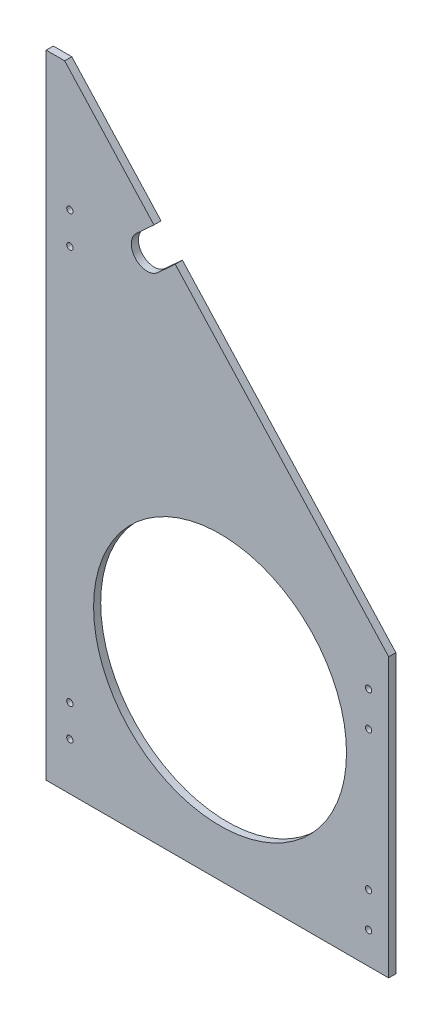
ISO-10303-21;
HEADER;
FILE_DESCRIPTION(('STEP AP214'),'2;1');
FILE_NAME('part.step','',(''),(''),'','','');
FILE_SCHEMA(('AUTOMOTIVE_DESIGN { 1 0 10303 214 1 1 1 1 }'));
ENDSEC;
DATA;
#1=APPLICATION_CONTEXT('core data for automotive mechanical design processes');
#2=APPLICATION_PROTOCOL_DEFINITION('international standard','automotive_design',2000,#1);
#3=PRODUCT_CONTEXT('',#1,'mechanical');
#4=PRODUCT('Part','Part','',(#3));
#5=PRODUCT_RELATED_PRODUCT_CATEGORY('part','',(#4));
#6=PRODUCT_DEFINITION_FORMATION('','',#4);
#7=PRODUCT_DEFINITION_CONTEXT('part definition',#1,'design');
#8=PRODUCT_DEFINITION('design','',#6,#7);
#9=PRODUCT_DEFINITION_SHAPE('','',#8);
#10=(LENGTH_UNIT() NAMED_UNIT(*) SI_UNIT(.MILLI.,.METRE.));
#11=(NAMED_UNIT(*) PLANE_ANGLE_UNIT() SI_UNIT($,.RADIAN.));
#12=(NAMED_UNIT(*) SI_UNIT($,.STERADIAN.) SOLID_ANGLE_UNIT());
#13=UNCERTAINTY_MEASURE_WITH_UNIT(LENGTH_MEASURE(1.E-05),#10,'distance_accuracy_value','');
#14=(GEOMETRIC_REPRESENTATION_CONTEXT(3) GLOBAL_UNCERTAINTY_ASSIGNED_CONTEXT((#13)) GLOBAL_UNIT_ASSIGNED_CONTEXT((#10,
#11,#12)) REPRESENTATION_CONTEXT('',''));
#15=CARTESIAN_POINT('',(0.,0.,0.));
#16=DIRECTION('',(0.,0.,1.));
#17=DIRECTION('',(1.,0.,0.));
#18=AXIS2_PLACEMENT_3D('',#15,#16,#17);
#19=CARTESIAN_POINT('',(216.7,176.,4.5));
#20=DIRECTION('',(-0.737700712036125,-0.675127883783061,0.));
#21=DIRECTION('',(0.675127883783061,-0.737700712036125,0.));
#22=AXIS2_PLACEMENT_3D('',#19,#20,#21);
#23=PLANE('',#22);
#24=DIRECTION('',(-0.675127883783061,0.737700712036125,0.));
#25=VECTOR('',#24,1.);
#26=CARTESIAN_POINT('',(216.7,176.,4.5));
#27=LINE('',#26,#25);
#28=CARTESIAN_POINT('',(68.1718655677265,338.294156647948,4.5));
#29=VERTEX_POINT('',#28);
#30=CARTESIAN_POINT('',(11.7,400.,4.5));
#31=VERTEX_POINT('',#30);
#32=EDGE_CURVE('E106',#29,#31,#27,.T.);
#33=ORIENTED_EDGE('',*,*,#32,.F.);
#34=DIRECTION('',(0.,0.,1.));
#35=VECTOR('',#34,1.);
#36=CARTESIAN_POINT('',(68.1718655677265,338.294156647948,-0.00100000000000013));
#37=LINE('',#36,#35);
#38=CARTESIAN_POINT('',(68.1718655677265,338.294156647948,0.));
#39=VERTEX_POINT('',#38);
#40=EDGE_CURVE('E189',#39,#29,#37,.T.);
#41=ORIENTED_EDGE('',*,*,#40,.F.);
#42=DIRECTION('',(-0.675127883783061,0.737700712036125,0.));
#43=VECTOR('',#42,1.);
#44=CARTESIAN_POINT('',(216.7,176.,0.));
#45=LINE('',#44,#43);
#46=CARTESIAN_POINT('',(11.7,400.,0.));
#47=VERTEX_POINT('',#46);
#48=EDGE_CURVE('E132',#39,#47,#45,.T.);
#49=ORIENTED_EDGE('',*,*,#48,.T.);
#50=DIRECTION('',(0.,0.,-1.));
#51=VECTOR('',#50,1.);
#52=CARTESIAN_POINT('',(11.7,400.,4.5));
#53=LINE('',#52,#51);
#54=EDGE_CURVE('E116',#31,#47,#53,.T.);
#55=ORIENTED_EDGE('',*,*,#54,.F.);
#56=EDGE_LOOP('',(#33,#41,#49,#55));
#57=FACE_BOUND('',#56,.T.);
#58=ADVANCED_FACE('F34',(#57),#23,.F.);
#59=CARTESIAN_POINT('',(0.,0.,4.5));
#60=DIRECTION('',(0.,0.,1.));
#61=DIRECTION('',(1.,0.,0.));
#62=AXIS2_PLACEMENT_3D('',#59,#60,#61);
#63=PLANE('',#62);
#64=CARTESIAN_POINT('',(203.95,20.,4.5));
#65=DIRECTION('',(0.,0.,1.));
#66=DIRECTION('',(1.,0.,0.));
#67=AXIS2_PLACEMENT_3D('',#64,#65,#66);
#68=CIRCLE('',#67,2.);
#69=CARTESIAN_POINT('',(205.95,20.,4.5));
#70=VERTEX_POINT('',#69);
#71=EDGE_CURVE('E213',#70,#70,#68,.T.);
#72=ORIENTED_EDGE('',*,*,#71,.F.);
#73=EDGE_LOOP('',(#72));
#74=FACE_BOUND('',#73,.T.);
#75=DIRECTION('',(-0.737700712036125,-0.675127883783061,0.));
#76=VECTOR('',#75,1.);
#77=CARTESIAN_POINT('',(57.1063548871846,328.167238391202,4.5));
#78=LINE('',#77,#76);
#79=CARTESIAN_POINT('',(57.1063548871846,328.167238391202,4.5));
#80=VERTEX_POINT('',#79);
#81=EDGE_CURVE('E171',#29,#80,#78,.T.);
#82=ORIENTED_EDGE('',*,*,#81,.F.);
#83=ORIENTED_EDGE('',*,*,#32,.T.);
#84=DIRECTION('',(-1.,0.,0.));
#85=VECTOR('',#84,1.);
#86=CARTESIAN_POINT('',(0.,400.,4.5));
#87=LINE('',#86,#85);
#88=CARTESIAN_POINT('',(0.,400.,4.5));
#89=VERTEX_POINT('',#88);
#90=EDGE_CURVE('E58',#31,#89,#87,.T.);
#91=ORIENTED_EDGE('',*,*,#90,.T.);
#92=DIRECTION('',(0.,-1.,0.));
#93=VECTOR('',#92,1.);
#94=CARTESIAN_POINT('',(0.,400.,4.5));
#95=LINE('',#94,#93);
#96=CARTESIAN_POINT('',(0.,0.,4.5));
#97=VERTEX_POINT('',#96);
#98=EDGE_CURVE('E136',#89,#97,#95,.T.);
#99=ORIENTED_EDGE('',*,*,#98,.T.);
#100=DIRECTION('',(1.,0.,0.));
#101=VECTOR('',#100,1.);
#102=CARTESIAN_POINT('',(0.,0.,4.5));
#103=LINE('',#102,#101);
#104=CARTESIAN_POINT('',(216.7,0.,4.5));
#105=VERTEX_POINT('',#104);
#106=EDGE_CURVE('E90',#97,#105,#103,.T.);
#107=ORIENTED_EDGE('',*,*,#106,.T.);
#108=DIRECTION('',(0.,1.,0.));
#109=VECTOR('',#108,1.);
#110=CARTESIAN_POINT('',(216.7,0.,4.5));
#111=LINE('',#110,#109);
#112=CARTESIAN_POINT('',(216.7,176.,4.5));
#113=VERTEX_POINT('',#112);
#114=EDGE_CURVE('E97',#105,#113,#111,.T.);
#115=ORIENTED_EDGE('',*,*,#114,.T.);
#116=CARTESIAN_POINT('',(81.6744232433878,323.540142407225,4.5));
#117=VERTEX_POINT('',#116);
#118=EDGE_CURVE('E103',#113,#117,#27,.T.);
#119=ORIENTED_EDGE('',*,*,#118,.T.);
#120=DIRECTION('',(0.737700712036125,0.675127883783061,0.));
#121=VECTOR('',#120,1.);
#122=CARTESIAN_POINT('',(70.6089125628459,313.413224150479,4.5));
#123=LINE('',#122,#121);
#124=CARTESIAN_POINT('',(70.6089125628459,313.413224150479,4.5));
#125=VERTEX_POINT('',#124);
#126=EDGE_CURVE('E49',#125,#117,#123,.T.);
#127=ORIENTED_EDGE('',*,*,#126,.F.);
#128=CARTESIAN_POINT('',(63.8576337250153,320.79023127084,4.5));
#129=DIRECTION('',(0.,0.,1.));
#130=DIRECTION('',(1.,0.,0.));
#131=AXIS2_PLACEMENT_3D('',#128,#129,#130);
#132=CIRCLE('',#131,10.);
#133=EDGE_CURVE('E170',#80,#125,#132,.T.);
#134=ORIENTED_EDGE('',*,*,#133,.F.);
#135=EDGE_LOOP('',(#82,#83,#91,#99,#107,#115,#119,#127,#134));
#136=FACE_BOUND('',#135,.T.);
#137=CARTESIAN_POINT('',(15.,320.,4.5));
#138=DIRECTION('',(0.,0.,1.));
#139=DIRECTION('',(1.,0.,0.));
#140=AXIS2_PLACEMENT_3D('',#137,#138,#139);
#141=CIRCLE('',#140,2.00000000000001);
#142=CARTESIAN_POINT('',(17.,320.,4.5));
#143=VERTEX_POINT('',#142);
#144=EDGE_CURVE('E174',#143,#143,#141,.T.);
#145=ORIENTED_EDGE('',*,*,#144,.F.);
#146=EDGE_LOOP('',(#145));
#147=FACE_BOUND('',#146,.T.);
#148=CARTESIAN_POINT('',(15.,300.,4.5));
#149=DIRECTION('',(0.,0.,1.));
#150=DIRECTION('',(1.,0.,0.));
#151=AXIS2_PLACEMENT_3D('',#148,#149,#150);
#152=CIRCLE('',#151,2.00000000000001);
#153=CARTESIAN_POINT('',(17.,300.,4.5));
#154=VERTEX_POINT('',#153);
#155=EDGE_CURVE('E314',#154,#154,#152,.T.);
#156=ORIENTED_EDGE('',*,*,#155,.F.);
#157=EDGE_LOOP('',(#156));
#158=FACE_BOUND('',#157,.T.);
#159=CARTESIAN_POINT('',(15.,50.,4.5));
#160=DIRECTION('',(0.,0.,1.));
#161=DIRECTION('',(1.,0.,0.));
#162=AXIS2_PLACEMENT_3D('',#159,#160,#161);
#163=CIRCLE('',#162,2.00000000000001);
#164=CARTESIAN_POINT('',(17.,50.,4.5));
#165=VERTEX_POINT('',#164);
#166=EDGE_CURVE('E308',#165,#165,#163,.T.);
#167=ORIENTED_EDGE('',*,*,#166,.F.);
#168=EDGE_LOOP('',(#167));
#169=FACE_BOUND('',#168,.T.);
#170=CARTESIAN_POINT('',(203.95,42.,4.5));
#171=DIRECTION('',(0.,0.,1.));
#172=DIRECTION('',(1.,0.,0.));
#173=AXIS2_PLACEMENT_3D('',#170,#171,#172);
#174=CIRCLE('',#173,2.);
#175=CARTESIAN_POINT('',(205.95,42.,4.5));
#176=VERTEX_POINT('',#175);
#177=EDGE_CURVE('E206',#176,#176,#174,.T.);
#178=ORIENTED_EDGE('',*,*,#177,.F.);
#179=EDGE_LOOP('',(#178));
#180=FACE_BOUND('',#179,.T.);
#181=CARTESIAN_POINT('',(203.95,130.,4.5));
#182=DIRECTION('',(0.,0.,1.));
#183=DIRECTION('',(1.,0.,0.));
#184=AXIS2_PLACEMENT_3D('',#181,#182,#183);
#185=CIRCLE('',#184,2.);
#186=CARTESIAN_POINT('',(205.95,130.,4.5));
#187=VERTEX_POINT('',#186);
#188=EDGE_CURVE('E199',#187,#187,#185,.T.);
#189=ORIENTED_EDGE('',*,*,#188,.F.);
#190=EDGE_LOOP('',(#189));
#191=FACE_BOUND('',#190,.T.);
#192=CARTESIAN_POINT('',(203.95,152.,4.5));
#193=DIRECTION('',(0.,0.,1.));
#194=DIRECTION('',(1.,0.,0.));
#195=AXIS2_PLACEMENT_3D('',#192,#193,#194);
#196=CIRCLE('',#195,2.);
#197=CARTESIAN_POINT('',(205.95,152.,4.5));
#198=VERTEX_POINT('',#197);
#199=EDGE_CURVE('E192',#198,#198,#196,.T.);
#200=ORIENTED_EDGE('',*,*,#199,.F.);
#201=EDGE_LOOP('',(#200));
#202=FACE_BOUND('',#201,.T.);
#203=CARTESIAN_POINT('',(15.,30.,4.5));
#204=DIRECTION('',(0.,0.,1.));
#205=DIRECTION('',(1.,0.,0.));
#206=AXIS2_PLACEMENT_3D('',#203,#204,#205);
#207=CIRCLE('',#206,2.00000000000001);
#208=CARTESIAN_POINT('',(17.,30.,4.5));
#209=VERTEX_POINT('',#208);
#210=EDGE_CURVE('E200',#209,#209,#207,.T.);
#211=ORIENTED_EDGE('',*,*,#210,.F.);
#212=EDGE_LOOP('',(#211));
#213=FACE_BOUND('',#212,.T.);
#214=CARTESIAN_POINT('',(110.,110.,4.5));
#215=DIRECTION('',(0.,0.,1.));
#216=DIRECTION('',(1.,0.,0.));
#217=AXIS2_PLACEMENT_3D('',#214,#215,#216);
#218=CIRCLE('',#217,80.);
#219=CARTESIAN_POINT('',(190.,110.,4.5));
#220=VERTEX_POINT('',#219);
#221=EDGE_CURVE('E129',#220,#220,#218,.T.);
#222=ORIENTED_EDGE('',*,*,#221,.F.);
#223=EDGE_LOOP('',(#222));
#224=FACE_BOUND('',#223,.T.);
#225=ADVANCED_FACE('F100',(#74,#136,#147,#158,#169,#180,#191,#202,#213,#224),#63,.T.);
#226=CARTESIAN_POINT('',(0.,0.,0.));
#227=DIRECTION('',(0.,0.,1.));
#228=DIRECTION('',(1.,0.,0.));
#229=AXIS2_PLACEMENT_3D('',#226,#227,#228);
#230=PLANE('',#229);
#231=CARTESIAN_POINT('',(203.95,20.,0.));
#232=DIRECTION('',(0.,0.,1.));
#233=DIRECTION('',(1.,0.,0.));
#234=AXIS2_PLACEMENT_3D('',#231,#232,#233);
#235=CIRCLE('',#234,2.);
#236=CARTESIAN_POINT('',(205.95,20.,0.));
#237=VERTEX_POINT('',#236);
#238=EDGE_CURVE('E223',#237,#237,#235,.F.);
#239=ORIENTED_EDGE('',*,*,#238,.F.);
#240=EDGE_LOOP('',(#239));
#241=FACE_BOUND('',#240,.T.);
#242=CARTESIAN_POINT('',(15.,320.,0.));
#243=DIRECTION('',(0.,0.,1.));
#244=DIRECTION('',(1.,0.,0.));
#245=AXIS2_PLACEMENT_3D('',#242,#243,#244);
#246=CIRCLE('',#245,2.00000000000001);
#247=CARTESIAN_POINT('',(17.,320.,0.));
#248=VERTEX_POINT('',#247);
#249=EDGE_CURVE('E181',#248,#248,#246,.F.);
#250=ORIENTED_EDGE('',*,*,#249,.F.);
#251=EDGE_LOOP('',(#250));
#252=FACE_BOUND('',#251,.T.);
#253=CARTESIAN_POINT('',(15.,300.,0.));
#254=DIRECTION('',(0.,0.,1.));
#255=DIRECTION('',(1.,0.,0.));
#256=AXIS2_PLACEMENT_3D('',#253,#254,#255);
#257=CIRCLE('',#256,2.00000000000001);
#258=CARTESIAN_POINT('',(17.,300.,0.));
#259=VERTEX_POINT('',#258);
#260=EDGE_CURVE('E311',#259,#259,#257,.F.);
#261=ORIENTED_EDGE('',*,*,#260,.F.);
#262=EDGE_LOOP('',(#261));
#263=FACE_BOUND('',#262,.T.);
#264=CARTESIAN_POINT('',(15.,50.,0.));
#265=DIRECTION('',(0.,0.,1.));
#266=DIRECTION('',(1.,0.,0.));
#267=AXIS2_PLACEMENT_3D('',#264,#265,#266);
#268=CIRCLE('',#267,2.00000000000001);
#269=CARTESIAN_POINT('',(17.,50.,0.));
#270=VERTEX_POINT('',#269);
#271=EDGE_CURVE('E203',#270,#270,#268,.F.);
#272=ORIENTED_EDGE('',*,*,#271,.F.);
#273=EDGE_LOOP('',(#272));
#274=FACE_BOUND('',#273,.T.);
#275=CARTESIAN_POINT('',(203.95,42.,0.));
#276=DIRECTION('',(0.,0.,1.));
#277=DIRECTION('',(1.,0.,0.));
#278=AXIS2_PLACEMENT_3D('',#275,#276,#277);
#279=CIRCLE('',#278,2.);
#280=CARTESIAN_POINT('',(205.95,42.,0.));
#281=VERTEX_POINT('',#280);
#282=EDGE_CURVE('E209',#281,#281,#279,.F.);
#283=ORIENTED_EDGE('',*,*,#282,.F.);
#284=EDGE_LOOP('',(#283));
#285=FACE_BOUND('',#284,.T.);
#286=CARTESIAN_POINT('',(203.95,130.,0.));
#287=DIRECTION('',(0.,0.,1.));
#288=DIRECTION('',(1.,0.,0.));
#289=AXIS2_PLACEMENT_3D('',#286,#287,#288);
#290=CIRCLE('',#289,2.);
#291=CARTESIAN_POINT('',(205.95,130.,0.));
#292=VERTEX_POINT('',#291);
#293=EDGE_CURVE('E210',#292,#292,#290,.F.);
#294=ORIENTED_EDGE('',*,*,#293,.F.);
#295=EDGE_LOOP('',(#294));
#296=FACE_BOUND('',#295,.T.);
#297=CARTESIAN_POINT('',(203.95,152.,0.));
#298=DIRECTION('',(0.,0.,1.));
#299=DIRECTION('',(1.,0.,0.));
#300=AXIS2_PLACEMENT_3D('',#297,#298,#299);
#301=CIRCLE('',#300,2.);
#302=CARTESIAN_POINT('',(205.95,152.,0.));
#303=VERTEX_POINT('',#302);
#304=EDGE_CURVE('E195',#303,#303,#301,.F.);
#305=ORIENTED_EDGE('',*,*,#304,.F.);
#306=EDGE_LOOP('',(#305));
#307=FACE_BOUND('',#306,.T.);
#308=CARTESIAN_POINT('',(15.,30.,0.));
#309=DIRECTION('',(0.,0.,1.));
#310=DIRECTION('',(1.,0.,0.));
#311=AXIS2_PLACEMENT_3D('',#308,#309,#310);
#312=CIRCLE('',#311,2.00000000000001);
#313=CARTESIAN_POINT('',(17.,30.,0.));
#314=VERTEX_POINT('',#313);
#315=EDGE_CURVE('E196',#314,#314,#312,.F.);
#316=ORIENTED_EDGE('',*,*,#315,.F.);
#317=EDGE_LOOP('',(#316));
#318=FACE_BOUND('',#317,.T.);
#319=ORIENTED_EDGE('',*,*,#48,.F.);
#320=DIRECTION('',(0.737700712036125,0.675127883783061,0.));
#321=VECTOR('',#320,1.);
#322=CARTESIAN_POINT('',(57.1063548871846,328.167238391202,0.));
#323=LINE('',#322,#321);
#324=CARTESIAN_POINT('',(57.1063548871846,328.167238391202,0.));
#325=VERTEX_POINT('',#324);
#326=EDGE_CURVE('E177',#325,#39,#323,.T.);
#327=ORIENTED_EDGE('',*,*,#326,.F.);
#328=CARTESIAN_POINT('',(63.8576337250153,320.79023127084,0.));
#329=DIRECTION('',(0.,0.,1.));
#330=DIRECTION('',(1.,0.,0.));
#331=AXIS2_PLACEMENT_3D('',#328,#329,#330);
#332=CIRCLE('',#331,10.);
#333=CARTESIAN_POINT('',(70.6089125628459,313.413224150479,0.));
#334=VERTEX_POINT('',#333);
#335=EDGE_CURVE('E167',#334,#325,#332,.F.);
#336=ORIENTED_EDGE('',*,*,#335,.F.);
#337=DIRECTION('',(-0.737700712036125,-0.675127883783061,0.));
#338=VECTOR('',#337,1.);
#339=CARTESIAN_POINT('',(70.6089125628459,313.413224150479,0.));
#340=LINE('',#339,#338);
#341=CARTESIAN_POINT('',(81.6744232433878,323.540142407225,0.));
#342=VERTEX_POINT('',#341);
#343=EDGE_CURVE('E147',#342,#334,#340,.T.);
#344=ORIENTED_EDGE('',*,*,#343,.F.);
#345=CARTESIAN_POINT('',(216.7,176.,0.));
#346=VERTEX_POINT('',#345);
#347=EDGE_CURVE('E133',#346,#342,#45,.T.);
#348=ORIENTED_EDGE('',*,*,#347,.F.);
#349=DIRECTION('',(0.,1.,0.));
#350=VECTOR('',#349,1.);
#351=CARTESIAN_POINT('',(216.7,0.,0.));
#352=LINE('',#351,#350);
#353=CARTESIAN_POINT('',(216.7,0.,0.));
#354=VERTEX_POINT('',#353);
#355=EDGE_CURVE('E112',#354,#346,#352,.T.);
#356=ORIENTED_EDGE('',*,*,#355,.F.);
#357=DIRECTION('',(1.,0.,0.));
#358=VECTOR('',#357,1.);
#359=CARTESIAN_POINT('',(0.,0.,0.));
#360=LINE('',#359,#358);
#361=CARTESIAN_POINT('',(0.,0.,0.));
#362=VERTEX_POINT('',#361);
#363=EDGE_CURVE('E128',#362,#354,#360,.T.);
#364=ORIENTED_EDGE('',*,*,#363,.F.);
#365=DIRECTION('',(0.,-1.,0.));
#366=VECTOR('',#365,1.);
#367=CARTESIAN_POINT('',(0.,400.,0.));
#368=LINE('',#367,#366);
#369=CARTESIAN_POINT('',(0.,400.,0.));
#370=VERTEX_POINT('',#369);
#371=EDGE_CURVE('E125',#370,#362,#368,.T.);
#372=ORIENTED_EDGE('',*,*,#371,.F.);
#373=DIRECTION('',(-1.,0.,0.));
#374=VECTOR('',#373,1.);
#375=CARTESIAN_POINT('',(0.,400.,0.));
#376=LINE('',#375,#374);
#377=EDGE_CURVE('E82',#47,#370,#376,.T.);
#378=ORIENTED_EDGE('',*,*,#377,.F.);
#379=EDGE_LOOP('',(#319,#327,#336,#344,#348,#356,#364,#372,#378));
#380=FACE_BOUND('',#379,.T.);
#381=CARTESIAN_POINT('',(110.,110.,0.));
#382=DIRECTION('',(0.,0.,1.));
#383=DIRECTION('',(1.,0.,0.));
#384=AXIS2_PLACEMENT_3D('',#381,#382,#383);
#385=CIRCLE('',#384,80.);
#386=CARTESIAN_POINT('',(190.,110.,0.));
#387=VERTEX_POINT('',#386);
#388=EDGE_CURVE('E220',#387,#387,#385,.T.);
#389=ORIENTED_EDGE('',*,*,#388,.T.);
#390=EDGE_LOOP('',(#389));
#391=FACE_BOUND('',#390,.T.);
#392=ADVANCED_FACE('F140',(#241,#252,#263,#274,#285,#296,#307,#318,#380,#391),#230,.F.);
#393=CARTESIAN_POINT('',(0.,400.,4.5));
#394=DIRECTION('',(1.,0.,0.));
#395=DIRECTION('',(0.,1.,0.));
#396=AXIS2_PLACEMENT_3D('',#393,#394,#395);
#397=PLANE('',#396);
#398=ORIENTED_EDGE('',*,*,#371,.T.);
#399=DIRECTION('',(0.,0.,-1.));
#400=VECTOR('',#399,1.);
#401=CARTESIAN_POINT('',(0.,0.,4.5));
#402=LINE('',#401,#400);
#403=EDGE_CURVE('E11',#97,#362,#402,.T.);
#404=ORIENTED_EDGE('',*,*,#403,.F.);
#405=ORIENTED_EDGE('',*,*,#98,.F.);
#406=DIRECTION('',(0.,0.,-1.));
#407=VECTOR('',#406,1.);
#408=CARTESIAN_POINT('',(0.,400.,4.5));
#409=LINE('',#408,#407);
#410=EDGE_CURVE('E121',#89,#370,#409,.T.);
#411=ORIENTED_EDGE('',*,*,#410,.T.);
#412=EDGE_LOOP('',(#398,#404,#405,#411));
#413=FACE_BOUND('',#412,.T.);
#414=ADVANCED_FACE('F36',(#413),#397,.F.);
#415=CARTESIAN_POINT('',(0.,0.,4.5));
#416=DIRECTION('',(0.,1.,0.));
#417=DIRECTION('',(0.,0.,1.));
#418=AXIS2_PLACEMENT_3D('',#415,#416,#417);
#419=PLANE('',#418);
#420=ORIENTED_EDGE('',*,*,#363,.T.);
#421=DIRECTION('',(0.,0.,-1.));
#422=VECTOR('',#421,1.);
#423=CARTESIAN_POINT('',(216.7,0.,4.5));
#424=LINE('',#423,#422);
#425=EDGE_CURVE('E42',#105,#354,#424,.T.);
#426=ORIENTED_EDGE('',*,*,#425,.F.);
#427=ORIENTED_EDGE('',*,*,#106,.F.);
#428=ORIENTED_EDGE('',*,*,#403,.T.);
#429=EDGE_LOOP('',(#420,#426,#427,#428));
#430=FACE_BOUND('',#429,.T.);
#431=ADVANCED_FACE('F227',(#430),#419,.F.);
#432=CARTESIAN_POINT('',(216.7,0.,4.5));
#433=DIRECTION('',(-1.,0.,0.));
#434=DIRECTION('',(0.,0.,1.));
#435=AXIS2_PLACEMENT_3D('',#432,#433,#434);
#436=PLANE('',#435);
#437=ORIENTED_EDGE('',*,*,#355,.T.);
#438=DIRECTION('',(0.,0.,-1.));
#439=VECTOR('',#438,1.);
#440=CARTESIAN_POINT('',(216.7,176.,4.5));
#441=LINE('',#440,#439);
#442=EDGE_CURVE('E109',#113,#346,#441,.T.);
#443=ORIENTED_EDGE('',*,*,#442,.F.);
#444=ORIENTED_EDGE('',*,*,#114,.F.);
#445=ORIENTED_EDGE('',*,*,#425,.T.);
#446=EDGE_LOOP('',(#437,#443,#444,#445));
#447=FACE_BOUND('',#446,.T.);
#448=ADVANCED_FACE('F110',(#447),#436,.F.);
#449=ORIENTED_EDGE('',*,*,#347,.T.);
#450=DIRECTION('',(0.,0.,1.));
#451=VECTOR('',#450,1.);
#452=CARTESIAN_POINT('',(81.6744232433878,323.540142407225,-0.00100000000000013));
#453=LINE('',#452,#451);
#454=EDGE_CURVE('E119',#342,#117,#453,.T.);
#455=ORIENTED_EDGE('',*,*,#454,.T.);
#456=ORIENTED_EDGE('',*,*,#118,.F.);
#457=ORIENTED_EDGE('',*,*,#442,.T.);
#458=EDGE_LOOP('',(#449,#455,#456,#457));
#459=FACE_BOUND('',#458,.T.);
#460=ADVANCED_FACE('F118',(#459),#23,.F.);
#461=CARTESIAN_POINT('',(0.,400.,4.5));
#462=DIRECTION('',(0.,-1.,0.));
#463=DIRECTION('',(0.,0.,-1.));
#464=AXIS2_PLACEMENT_3D('',#461,#462,#463);
#465=PLANE('',#464);
#466=ORIENTED_EDGE('',*,*,#377,.T.);
#467=ORIENTED_EDGE('',*,*,#410,.F.);
#468=ORIENTED_EDGE('',*,*,#90,.F.);
#469=ORIENTED_EDGE('',*,*,#54,.T.);
#470=EDGE_LOOP('',(#466,#467,#468,#469));
#471=FACE_BOUND('',#470,.T.);
#472=ADVANCED_FACE('F245',(#471),#465,.F.);
#473=CARTESIAN_POINT('',(110.,110.,4.5));
#474=DIRECTION('',(0.,0.,-1.));
#475=DIRECTION('',(-1.,0.,0.));
#476=AXIS2_PLACEMENT_3D('',#473,#474,#475);
#477=CYLINDRICAL_SURFACE('',#476,80.);
#478=ORIENTED_EDGE('',*,*,#221,.T.);
#479=EDGE_LOOP('',(#478));
#480=FACE_BOUND('',#479,.T.);
#481=ORIENTED_EDGE('',*,*,#388,.F.);
#482=EDGE_LOOP('',(#481));
#483=FACE_BOUND('',#482,.T.);
#484=ADVANCED_FACE('F249',(#480,#483),#477,.F.);
#485=CARTESIAN_POINT('',(63.8576337250153,320.79023127084,-0.00100000000000013));
#486=DIRECTION('',(0.,0.,1.));
#487=DIRECTION('',(1.,0.,0.));
#488=AXIS2_PLACEMENT_3D('',#485,#486,#487);
#489=CYLINDRICAL_SURFACE('',#488,10.);
#490=ORIENTED_EDGE('',*,*,#335,.T.);
#491=DIRECTION('',(0.,0.,1.));
#492=VECTOR('',#491,1.);
#493=CARTESIAN_POINT('',(57.1063548871846,328.167238391202,-0.00100000000000013));
#494=LINE('',#493,#492);
#495=EDGE_CURVE('E175',#325,#80,#494,.T.);
#496=ORIENTED_EDGE('',*,*,#495,.T.);
#497=ORIENTED_EDGE('',*,*,#133,.T.);
#498=DIRECTION('',(0.,0.,1.));
#499=VECTOR('',#498,1.);
#500=CARTESIAN_POINT('',(70.6089125628459,313.413224150479,-0.00100000000000013));
#501=LINE('',#500,#499);
#502=EDGE_CURVE('E165',#334,#125,#501,.T.);
#503=ORIENTED_EDGE('',*,*,#502,.F.);
#504=EDGE_LOOP('',(#490,#496,#497,#503));
#505=FACE_BOUND('',#504,.T.);
#506=ADVANCED_FACE('F166',(#505),#489,.F.);
#507=CARTESIAN_POINT('',(57.1063548871846,328.167238391202,-0.00100000000000013));
#508=DIRECTION('',(-0.675127883783061,0.737700712036125,0.));
#509=DIRECTION('',(-0.737700712036125,-0.675127883783061,0.));
#510=AXIS2_PLACEMENT_3D('',#507,#508,#509);
#511=PLANE('',#510);
#512=ORIENTED_EDGE('',*,*,#326,.T.);
#513=ORIENTED_EDGE('',*,*,#40,.T.);
#514=ORIENTED_EDGE('',*,*,#81,.T.);
#515=ORIENTED_EDGE('',*,*,#495,.F.);
#516=EDGE_LOOP('',(#512,#513,#514,#515));
#517=FACE_BOUND('',#516,.T.);
#518=ADVANCED_FACE('F278',(#517),#511,.F.);
#519=CARTESIAN_POINT('',(70.6089125628459,313.413224150479,-0.00100000000000013));
#520=DIRECTION('',(0.675127883783061,-0.737700712036125,0.));
#521=DIRECTION('',(0.737700712036125,0.675127883783061,0.));
#522=AXIS2_PLACEMENT_3D('',#519,#520,#521);
#523=PLANE('',#522);
#524=ORIENTED_EDGE('',*,*,#343,.T.);
#525=ORIENTED_EDGE('',*,*,#502,.T.);
#526=ORIENTED_EDGE('',*,*,#126,.T.);
#527=ORIENTED_EDGE('',*,*,#454,.F.);
#528=EDGE_LOOP('',(#524,#525,#526,#527));
#529=FACE_BOUND('',#528,.T.);
#530=ADVANCED_FACE('F173',(#529),#523,.F.);
#531=CARTESIAN_POINT('',(15.,30.,-0.00100000000000013));
#532=DIRECTION('',(0.,0.,1.));
#533=DIRECTION('',(1.,0.,0.));
#534=AXIS2_PLACEMENT_3D('',#531,#532,#533);
#535=CYLINDRICAL_SURFACE('',#534,2.00000000000001);
#536=ORIENTED_EDGE('',*,*,#210,.T.);
#537=EDGE_LOOP('',(#536));
#538=FACE_BOUND('',#537,.T.);
#539=ORIENTED_EDGE('',*,*,#315,.T.);
#540=EDGE_LOOP('',(#539));
#541=FACE_BOUND('',#540,.T.);
#542=ADVANCED_FACE('F269',(#538,#541),#535,.F.);
#543=CARTESIAN_POINT('',(203.95,152.,-0.00100000000000013));
#544=DIRECTION('',(0.,0.,1.));
#545=DIRECTION('',(1.,0.,0.));
#546=AXIS2_PLACEMENT_3D('',#543,#544,#545);
#547=CYLINDRICAL_SURFACE('',#546,2.);
#548=ORIENTED_EDGE('',*,*,#199,.T.);
#549=EDGE_LOOP('',(#548));
#550=FACE_BOUND('',#549,.T.);
#551=ORIENTED_EDGE('',*,*,#304,.T.);
#552=EDGE_LOOP('',(#551));
#553=FACE_BOUND('',#552,.T.);
#554=ADVANCED_FACE('F263',(#550,#553),#547,.F.);
#555=CARTESIAN_POINT('',(203.95,130.,-0.00100000000000013));
#556=DIRECTION('',(0.,0.,1.));
#557=DIRECTION('',(1.,0.,0.));
#558=AXIS2_PLACEMENT_3D('',#555,#556,#557);
#559=CYLINDRICAL_SURFACE('',#558,2.);
#560=ORIENTED_EDGE('',*,*,#188,.T.);
#561=EDGE_LOOP('',(#560));
#562=FACE_BOUND('',#561,.T.);
#563=ORIENTED_EDGE('',*,*,#293,.T.);
#564=EDGE_LOOP('',(#563));
#565=FACE_BOUND('',#564,.T.);
#566=ADVANCED_FACE('F259',(#562,#565),#559,.F.);
#567=CARTESIAN_POINT('',(203.95,42.,-0.00100000000000013));
#568=DIRECTION('',(0.,0.,1.));
#569=DIRECTION('',(1.,0.,0.));
#570=AXIS2_PLACEMENT_3D('',#567,#568,#569);
#571=CYLINDRICAL_SURFACE('',#570,2.);
#572=ORIENTED_EDGE('',*,*,#177,.T.);
#573=EDGE_LOOP('',(#572));
#574=FACE_BOUND('',#573,.T.);
#575=ORIENTED_EDGE('',*,*,#282,.T.);
#576=EDGE_LOOP('',(#575));
#577=FACE_BOUND('',#576,.T.);
#578=ADVANCED_FACE('F262',(#574,#577),#571,.F.);
#579=CARTESIAN_POINT('',(15.,50.,-0.00100000000000013));
#580=DIRECTION('',(0.,0.,1.));
#581=DIRECTION('',(1.,0.,0.));
#582=AXIS2_PLACEMENT_3D('',#579,#580,#581);
#583=CYLINDRICAL_SURFACE('',#582,2.00000000000001);
#584=ORIENTED_EDGE('',*,*,#166,.T.);
#585=EDGE_LOOP('',(#584));
#586=FACE_BOUND('',#585,.T.);
#587=ORIENTED_EDGE('',*,*,#271,.T.);
#588=EDGE_LOOP('',(#587));
#589=FACE_BOUND('',#588,.T.);
#590=ADVANCED_FACE('F267',(#586,#589),#583,.F.);
#591=CARTESIAN_POINT('',(15.,300.,-0.00100000000000013));
#592=DIRECTION('',(0.,0.,1.));
#593=DIRECTION('',(1.,0.,0.));
#594=AXIS2_PLACEMENT_3D('',#591,#592,#593);
#595=CYLINDRICAL_SURFACE('',#594,2.00000000000001);
#596=ORIENTED_EDGE('',*,*,#155,.T.);
#597=EDGE_LOOP('',(#596));
#598=FACE_BOUND('',#597,.T.);
#599=ORIENTED_EDGE('',*,*,#260,.T.);
#600=EDGE_LOOP('',(#599));
#601=FACE_BOUND('',#600,.T.);
#602=ADVANCED_FACE('F288',(#598,#601),#595,.F.);
#603=CARTESIAN_POINT('',(15.,320.,-0.00100000000000013));
#604=DIRECTION('',(0.,0.,1.));
#605=DIRECTION('',(1.,0.,0.));
#606=AXIS2_PLACEMENT_3D('',#603,#604,#605);
#607=CYLINDRICAL_SURFACE('',#606,2.00000000000001);
#608=ORIENTED_EDGE('',*,*,#144,.T.);
#609=EDGE_LOOP('',(#608));
#610=FACE_BOUND('',#609,.T.);
#611=ORIENTED_EDGE('',*,*,#249,.T.);
#612=EDGE_LOOP('',(#611));
#613=FACE_BOUND('',#612,.T.);
#614=ADVANCED_FACE('F284',(#610,#613),#607,.F.);
#615=CARTESIAN_POINT('',(203.95,20.,-0.00100000000000013));
#616=DIRECTION('',(0.,0.,1.));
#617=DIRECTION('',(1.,0.,0.));
#618=AXIS2_PLACEMENT_3D('',#615,#616,#617);
#619=CYLINDRICAL_SURFACE('',#618,2.);
#620=ORIENTED_EDGE('',*,*,#71,.T.);
#621=EDGE_LOOP('',(#620));
#622=FACE_BOUND('',#621,.T.);
#623=ORIENTED_EDGE('',*,*,#238,.T.);
#624=EDGE_LOOP('',(#623));
#625=FACE_BOUND('',#624,.T.);
#626=ADVANCED_FACE('F287',(#622,#625),#619,.F.);
#627=CLOSED_SHELL('',(#58,#225,#392,#414,#431,#448,#460,#472,#484,#506,#518,#530,#542,#554,#566,
#578,#590,#602,#614,#626));
#628=MANIFOLD_SOLID_BREP('B2',#627);
#629=ADVANCED_BREP_SHAPE_REPRESENTATION('',(#18,#628),#14);
#630=SHAPE_DEFINITION_REPRESENTATION(#9,#629);
ENDSEC;
END-ISO-10303-21;
